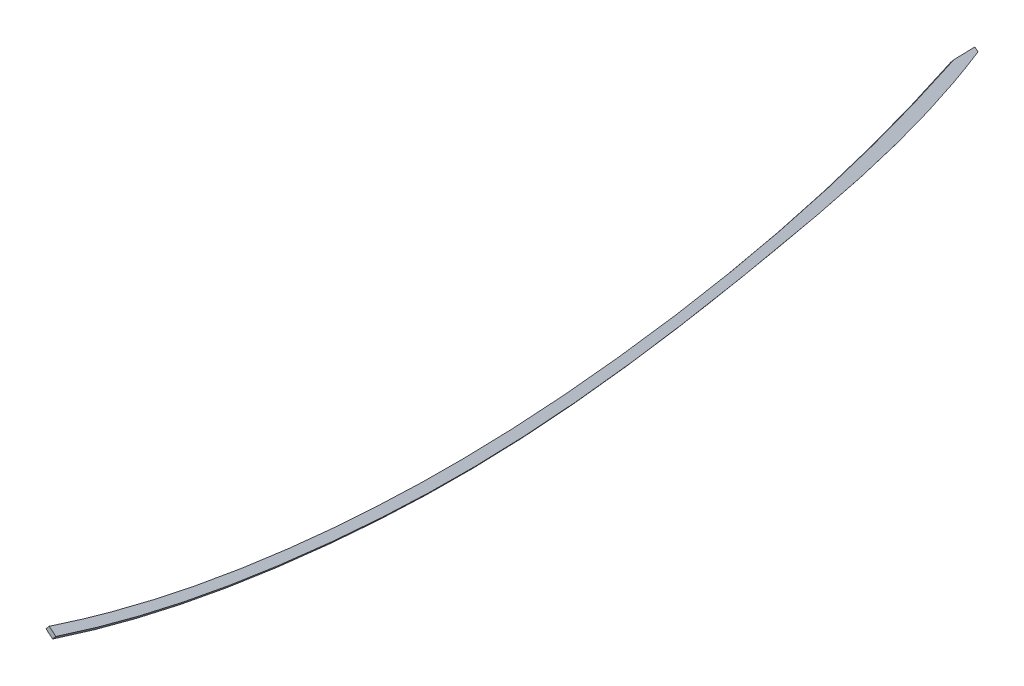
ISO-10303-21;
HEADER;
FILE_DESCRIPTION(('STEP AP214'),'2;1');
FILE_NAME('part.step','',(''),(''),'','','');
FILE_SCHEMA(('AUTOMOTIVE_DESIGN { 1 0 10303 214 1 1 1 1 }'));
ENDSEC;
DATA;
#1=APPLICATION_CONTEXT('core data for automotive mechanical design processes');
#2=APPLICATION_PROTOCOL_DEFINITION('international standard','automotive_design',2000,#1);
#3=PRODUCT_CONTEXT('',#1,'mechanical');
#4=PRODUCT('Part','Part','',(#3));
#5=PRODUCT_RELATED_PRODUCT_CATEGORY('part','',(#4));
#6=PRODUCT_DEFINITION_FORMATION('','',#4);
#7=PRODUCT_DEFINITION_CONTEXT('part definition',#1,'design');
#8=PRODUCT_DEFINITION('design','',#6,#7);
#9=PRODUCT_DEFINITION_SHAPE('','',#8);
#10=(LENGTH_UNIT() NAMED_UNIT(*) SI_UNIT(.MILLI.,.METRE.));
#11=(NAMED_UNIT(*) PLANE_ANGLE_UNIT() SI_UNIT($,.RADIAN.));
#12=(NAMED_UNIT(*) SI_UNIT($,.STERADIAN.) SOLID_ANGLE_UNIT());
#13=UNCERTAINTY_MEASURE_WITH_UNIT(LENGTH_MEASURE(1.E-05),#10,'distance_accuracy_value','');
#14=(GEOMETRIC_REPRESENTATION_CONTEXT(3) GLOBAL_UNCERTAINTY_ASSIGNED_CONTEXT((#13)) GLOBAL_UNIT_ASSIGNED_CONTEXT((#10,
#11,#12)) REPRESENTATION_CONTEXT('',''));
#15=CARTESIAN_POINT('',(0.,0.,0.));
#16=DIRECTION('',(0.,0.,1.));
#17=DIRECTION('',(1.,0.,0.));
#18=AXIS2_PLACEMENT_3D('',#15,#16,#17);
#19=CARTESIAN_POINT('',(2.48042316721792,49.8898428421156,10.2561218582418));
#20=DIRECTION('',(0.,0.,1.));
#21=DIRECTION('',(1.,0.,0.));
#22=AXIS2_PLACEMENT_3D('',#19,#20,#21);
#23=PLANE('',#22);
#24=DIRECTION('',(-0.76604444311898,0.642787609686537,0.));
#25=VECTOR('',#24,1.);
#26=CARTESIAN_POINT('',(0.539204585964579,47.5763886238963,10.2561218582418));
#27=LINE('',#26,#25);
#28=CARTESIAN_POINT('',(2.46006727268094,45.9645934519304,10.2561218582418));
#29=VERTEX_POINT('',#28);
#30=CARTESIAN_POINT('',(0.539204585964579,47.5763886238963,10.2561218582418));
#31=VERTEX_POINT('',#30);
#32=EDGE_CURVE('E122',#29,#31,#27,.T.);
#33=ORIENTED_EDGE('',*,*,#32,.T.);
#34=DIRECTION('',(-0.642787609686538,-0.766044443118979,0.));
#35=VECTOR('',#34,1.);
#36=CARTESIAN_POINT('',(2.48042316721792,49.8898428421156,10.2561218582418));
#37=LINE('',#36,#35);
#38=CARTESIAN_POINT('',(2.48042316721792,49.8898428421156,10.2561218582418));
#39=VERTEX_POINT('',#38);
#40=EDGE_CURVE('E11',#39,#31,#37,.T.);
#41=ORIENTED_EDGE('',*,*,#40,.F.);
#42=DIRECTION('',(-0.76604444311898,0.642787609686537,0.));
#43=VECTOR('',#42,1.);
#44=CARTESIAN_POINT('',(2.48042316721792,49.8898428421156,10.2561218582418));
#45=LINE('',#44,#43);
#46=CARTESIAN_POINT('',(4.40128585393428,48.2780476701497,10.2561218582418));
#47=VERTEX_POINT('',#46);
#48=EDGE_CURVE('E150',#47,#39,#45,.T.);
#49=ORIENTED_EDGE('',*,*,#48,.F.);
#50=DIRECTION('',(-0.642787609686538,-0.766044443118979,0.));
#51=VECTOR('',#50,1.);
#52=CARTESIAN_POINT('',(4.40128585393428,48.2780476701497,10.2561218582418));
#53=LINE('',#52,#51);
#54=EDGE_CURVE('E115',#47,#29,#53,.T.);
#55=ORIENTED_EDGE('',*,*,#54,.T.);
#56=EDGE_LOOP('',(#33,#41,#49,#55));
#57=FACE_BOUND('',#56,.T.);
#58=ADVANCED_FACE('F35',(#57),#23,.F.);
#59=CARTESIAN_POINT('',(2.48042316721792,49.8898428421156,10.2561218582418));
#60=DIRECTION('',(0.76591204130285,-0.642676511371457,-0.0185915765527171));
#61=DIRECTION('',(0.642787609686538,0.766044443118979,0.));
#62=AXIS2_PLACEMENT_3D('',#59,#60,#61);
#63=PLANE('',#62);
#64=DIRECTION('',(0.0142419739070301,-0.0119504350526252,0.999827161704104));
#65=VECTOR('',#64,1.);
#66=CARTESIAN_POINT('',(0.539204585964579,47.5763886238963,10.2561218582418));
#67=LINE('',#66,#65);
#68=CARTESIAN_POINT('',(0.720325396065519,47.4244102189421,22.9713189700257));
#69=VERTEX_POINT('',#68);
#70=EDGE_CURVE('E169',#31,#69,#67,.T.);
#71=ORIENTED_EDGE('',*,*,#70,.T.);
#72=DIRECTION('',(-0.642787609686538,-0.766044443118979,0.));
#73=VECTOR('',#72,1.);
#74=CARTESIAN_POINT('',(2.66154397731886,49.7378644371614,22.9713189700257));
#75=LINE('',#74,#73);
#76=CARTESIAN_POINT('',(2.66154397731886,49.7378644371614,22.9713189700257));
#77=VERTEX_POINT('',#76);
#78=EDGE_CURVE('E43',#77,#69,#75,.T.);
#79=ORIENTED_EDGE('',*,*,#78,.F.);
#80=DIRECTION('',(0.0142419739070301,-0.0119504350526252,0.999827161704104));
#81=VECTOR('',#80,1.);
#82=CARTESIAN_POINT('',(2.48042316721792,49.8898428421156,10.2561218582418));
#83=LINE('',#82,#81);
#84=EDGE_CURVE('E88',#39,#77,#83,.T.);
#85=ORIENTED_EDGE('',*,*,#84,.F.);
#86=ORIENTED_EDGE('',*,*,#40,.T.);
#87=EDGE_LOOP('',(#71,#79,#85,#86));
#88=FACE_BOUND('',#87,.T.);
#89=ADVANCED_FACE('F140',(#88),#63,.F.);
#90=CARTESIAN_POINT('',(2.66154397731886,49.7378644371614,22.9713189700257));
#91=CARTESIAN_POINT('',(3.60586249712661,48.9454871154768,27.5277927775798));
#92=CARTESIAN_POINT('',(6.90223906247647,46.1794987552704,43.876767358655));
#93=CARTESIAN_POINT('',(14.2044692776809,40.0522000749208,83.986139195422));
#94=CARTESIAN_POINT('',(22.757970345705,32.8749604834673,143.807287576109));
#95=CARTESIAN_POINT('',(28.7037433074796,27.8858645841784,204.203556997866));
#96=CARTESIAN_POINT('',(32.1191313510047,25.0200137365292,252.744331416821));
#97=CARTESIAN_POINT('',(34.7043197060017,22.8507831413274,301.363646845112));
#98=CARTESIAN_POINT('',(36.1078456473503,21.673085041594,362.203336360637));
#99=CARTESIAN_POINT('',(34.4525618855359,23.0620330356262,423.012310573511));
#100=CARTESIAN_POINT('',(31.1372004615529,25.8439515837097,471.506682416074));
#101=CARTESIAN_POINT('',(26.2870653699387,29.9136981502432,519.713782663925));
#102=CARTESIAN_POINT('',(20.5538396378893,34.7244457474619,555.328000116366));
#103=CARTESIAN_POINT('',(15.4990409485372,38.9659254633727,578.638126336223));
#104=B_SPLINE_CURVE_WITH_KNOTS('',3,(#90,#91,#92,#93,#94,#95,#96,#97,#98,#99,#100,#101,#102,
#103),.UNSPECIFIED.,.F.,.F.,(4,1,1,1,1,1,1,1,1,1,1,4),(0.,0.0242064129563663,0.0867064129563663,
0.211706412956366,0.336706412956366,0.399206412956366,0.461706412956366,0.586706412956366,
0.711706412956366,0.774206412956366,0.836706412956366,0.961706412956366),.UNSPECIFIED.);
#105=DIRECTION('',(-0.642787609686538,-0.766044443118979,0.));
#106=VECTOR('',#105,1.);
#107=SURFACE_OF_LINEAR_EXTRUSION('',#104,#106);
#108=CARTESIAN_POINT('',(0.720325396065519,47.4244102189421,22.9713189700257));
#109=CARTESIAN_POINT('',(1.66464391587327,46.6320328972575,27.5277927775798));
#110=CARTESIAN_POINT('',(4.96102048122312,43.866044537051,43.876767358655));
#111=CARTESIAN_POINT('',(12.2632506964275,37.7387458567015,83.986139195422));
#112=CARTESIAN_POINT('',(20.8167517644516,30.561506265248,143.807287576109));
#113=CARTESIAN_POINT('',(26.7625247262262,25.5724103659591,204.203556997866));
#114=CARTESIAN_POINT('',(30.1779127697514,22.7065595183099,252.744331416821));
#115=CARTESIAN_POINT('',(32.7631011247484,20.5373289231081,301.363646845112));
#116=CARTESIAN_POINT('',(34.166627066097,19.3596308233747,362.203336360637));
#117=CARTESIAN_POINT('',(32.5113433042826,20.7485788174069,423.012310573511));
#118=CARTESIAN_POINT('',(29.1959818802996,23.5304973654904,471.506682416074));
#119=CARTESIAN_POINT('',(24.3458467886853,27.6002439320239,519.713782663925));
#120=CARTESIAN_POINT('',(18.612621056636,32.4109915292426,555.328000116366));
#121=CARTESIAN_POINT('',(13.5578223672838,36.6524712451534,578.638126336223));
#122=B_SPLINE_CURVE_WITH_KNOTS('',3,(#108,#109,#110,#111,#112,#113,#114,#115,#116,#117,#118,
#119,#120,#121),.UNSPECIFIED.,.F.,.F.,(4,1,1,1,1,1,1,1,1,1,1,4),(0.,0.0242064129563663,
0.0867064129563663,0.211706412956366,0.336706412956366,0.399206412956366,0.461706412956366,
0.586706412956366,0.711706412956366,0.774206412956366,0.836706412956366,0.961706412956366),.UNSPECIFIED.);
#123=CARTESIAN_POINT('',(13.5578223672838,36.6524712451534,578.638126336223));
#124=VERTEX_POINT('',#123);
#125=EDGE_CURVE('E166',#69,#124,#122,.T.);
#126=ORIENTED_EDGE('',*,*,#125,.T.);
#127=DIRECTION('',(-0.642787609686538,-0.766044443118979,0.));
#128=VECTOR('',#127,1.);
#129=CARTESIAN_POINT('',(15.4990409485372,38.9659254633727,578.638126336223));
#130=LINE('',#129,#128);
#131=CARTESIAN_POINT('',(15.4990409485372,38.9659254633727,578.638126336223));
#132=VERTEX_POINT('',#131);
#133=EDGE_CURVE('E110',#132,#124,#130,.T.);
#134=ORIENTED_EDGE('',*,*,#133,.F.);
#135=EDGE_CURVE('E101',#77,#132,#104,.T.);
#136=ORIENTED_EDGE('',*,*,#135,.F.);
#137=ORIENTED_EDGE('',*,*,#78,.T.);
#138=EDGE_LOOP('',(#126,#134,#136,#137));
#139=FACE_BOUND('',#138,.T.);
#140=ADVANCED_FACE('F138',(#139),#107,.F.);
#141=CARTESIAN_POINT('',(15.4990409485371,38.9659254633727,578.638126336223));
#142=DIRECTION('',(0.73708127933529,-0.618484629637917,0.272374651087617));
#143=DIRECTION('',(0.642787609686538,0.766044443118979,0.));
#144=AXIS2_PLACEMENT_3D('',#141,#142,#143);
#145=PLANE('',#144);
#146=DIRECTION('',(-0.20865108791214,0.175079050911814,0.962191274874647));
#147=VECTOR('',#146,1.);
#148=CARTESIAN_POINT('',(13.5578223672838,36.6524712451534,578.638126336223));
#149=LINE('',#148,#147);
#150=CARTESIAN_POINT('',(13.2625002792163,36.9002759003293,579.999999592));
#151=VERTEX_POINT('',#150);
#152=EDGE_CURVE('E109',#124,#151,#149,.T.);
#153=ORIENTED_EDGE('',*,*,#152,.T.);
#154=DIRECTION('',(-0.642787609686538,-0.766044443118979,0.));
#155=VECTOR('',#154,1.);
#156=CARTESIAN_POINT('',(15.2037188604697,39.2137301185486,579.999999592));
#157=LINE('',#156,#155);
#158=CARTESIAN_POINT('',(15.2037188604697,39.2137301185486,579.999999592));
#159=VERTEX_POINT('',#158);
#160=EDGE_CURVE('E106',#159,#151,#157,.T.);
#161=ORIENTED_EDGE('',*,*,#160,.F.);
#162=DIRECTION('',(-0.20865108791214,0.175079050911814,0.962191274874647));
#163=VECTOR('',#162,1.);
#164=CARTESIAN_POINT('',(15.4990409485371,38.9659254633727,578.638126336223));
#165=LINE('',#164,#163);
#166=EDGE_CURVE('E95',#132,#159,#165,.T.);
#167=ORIENTED_EDGE('',*,*,#166,.F.);
#168=ORIENTED_EDGE('',*,*,#133,.T.);
#169=EDGE_LOOP('',(#153,#161,#167,#168));
#170=FACE_BOUND('',#169,.T.);
#171=ADVANCED_FACE('F107',(#170),#145,.F.);
#172=CARTESIAN_POINT('',(15.2037188604697,39.2137301185486,579.999999592));
#173=DIRECTION('',(0.,0.,-1.));
#174=DIRECTION('',(-1.,0.,0.));
#175=AXIS2_PLACEMENT_3D('',#172,#173,#174);
#176=PLANE('',#175);
#177=DIRECTION('',(0.766044443118979,-0.642787609686538,0.));
#178=VECTOR('',#177,1.);
#179=CARTESIAN_POINT('',(13.2625002792163,36.9002759003293,579.999999592));
#180=LINE('',#179,#178);
#181=CARTESIAN_POINT('',(17.2432287640341,33.5600480969018,579.999999592));
#182=VERTEX_POINT('',#181);
#183=EDGE_CURVE('E74',#151,#182,#180,.T.);
#184=ORIENTED_EDGE('',*,*,#183,.T.);
#185=DIRECTION('',(-0.642787609686538,-0.766044443118979,0.));
#186=VECTOR('',#185,1.);
#187=CARTESIAN_POINT('',(19.1844473452874,35.8735023151212,579.999999592));
#188=LINE('',#187,#186);
#189=CARTESIAN_POINT('',(19.1844473452874,35.8735023151212,579.999999592));
#190=VERTEX_POINT('',#189);
#191=EDGE_CURVE('E111',#190,#182,#188,.T.);
#192=ORIENTED_EDGE('',*,*,#191,.F.);
#193=DIRECTION('',(0.766044443118979,-0.642787609686538,0.));
#194=VECTOR('',#193,1.);
#195=CARTESIAN_POINT('',(15.2037188604697,39.2137301185486,579.999999592));
#196=LINE('',#195,#194);
#197=EDGE_CURVE('E99',#159,#190,#196,.T.);
#198=ORIENTED_EDGE('',*,*,#197,.F.);
#199=ORIENTED_EDGE('',*,*,#160,.T.);
#200=EDGE_LOOP('',(#184,#192,#198,#199));
#201=FACE_BOUND('',#200,.T.);
#202=ADVANCED_FACE('F113',(#201),#176,.F.);
#203=CARTESIAN_POINT('',(19.1844473452874,35.8735023151212,579.999999592));
#204=CARTESIAN_POINT('',(28.403247495778,28.1380105089475,537.624946517335));
#205=CARTESIAN_POINT('',(37.2104355529574,20.7479022584593,460.757346258166));
#206=CARTESIAN_POINT('',(40.8755671645649,17.6724916749433,349.992619040852));
#207=CARTESIAN_POINT('',(36.4858146449487,21.3559313951128,249.65526662979));
#208=CARTESIAN_POINT('',(27.1843968741186,29.1607476160421,149.790758513288));
#209=CARTESIAN_POINT('',(17.8369021877719,37.0042269597872,68.8345138525367));
#210=CARTESIAN_POINT('',(7.82933098958451,45.4015762611666,23.417958502108));
#211=CARTESIAN_POINT('',(4.40128585393428,48.2780476701497,10.2561218582418));
#212=B_SPLINE_CURVE_WITH_KNOTS('',3,(#203,#204,#205,#206,#207,#208,#209,#210,#211),
.UNSPECIFIED.,.F.,.F.,(4,1,1,1,1,1,4),(0.,0.225071004183071,0.39564019727107,0.566277038425493,
0.737858902627529,0.910958545331661,0.981893872620999),.UNSPECIFIED.);
#213=DIRECTION('',(-0.642787609686538,-0.766044443118979,0.));
#214=VECTOR('',#213,1.);
#215=SURFACE_OF_LINEAR_EXTRUSION('',#212,#214);
#216=CARTESIAN_POINT('',(17.2432287640341,33.5600480969018,579.999999592));
#217=CARTESIAN_POINT('',(26.4620289145246,25.8245562907282,537.624946517335));
#218=CARTESIAN_POINT('',(35.2692169717041,18.43444804024,460.757346258166));
#219=CARTESIAN_POINT('',(38.9343485833115,15.359037456724,349.992619040852));
#220=CARTESIAN_POINT('',(34.5445960636953,19.0424771768935,249.65526662979));
#221=CARTESIAN_POINT('',(25.2431782928653,26.8472933978228,149.790758513288));
#222=CARTESIAN_POINT('',(15.8956836065185,34.6907727415679,68.8345138525367));
#223=CARTESIAN_POINT('',(5.88811240833116,43.0881220429472,23.417958502108));
#224=CARTESIAN_POINT('',(2.46006727268094,45.9645934519304,10.2561218582418));
#225=B_SPLINE_CURVE_WITH_KNOTS('',3,(#216,#217,#218,#219,#220,#221,#222,#223,#224),
.UNSPECIFIED.,.F.,.F.,(4,1,1,1,1,1,4),(0.,0.225071004183071,0.39564019727107,0.566277038425493,
0.737858902627529,0.910958545331661,0.981893872620999),.UNSPECIFIED.);
#226=EDGE_CURVE('E80',#182,#29,#225,.T.);
#227=ORIENTED_EDGE('',*,*,#226,.T.);
#228=ORIENTED_EDGE('',*,*,#54,.F.);
#229=EDGE_CURVE('E51',#190,#47,#212,.T.);
#230=ORIENTED_EDGE('',*,*,#229,.F.);
#231=ORIENTED_EDGE('',*,*,#191,.T.);
#232=EDGE_LOOP('',(#227,#228,#230,#231));
#233=FACE_BOUND('',#232,.T.);
#234=ADVANCED_FACE('F128',(#233),#215,.F.);
#235=CARTESIAN_POINT('',(38.1774580967354,19.9364739986351,294.087109932894));
#236=DIRECTION('',(-0.642787609686538,-0.766044443118979,0.));
#237=DIRECTION('',(0.766044443118979,-0.642787609686538,0.));
#238=AXIS2_PLACEMENT_3D('',#235,#236,#237);
#239=PLANE('',#238);
#240=ORIENTED_EDGE('',*,*,#48,.T.);
#241=ORIENTED_EDGE('',*,*,#84,.T.);
#242=ORIENTED_EDGE('',*,*,#135,.T.);
#243=ORIENTED_EDGE('',*,*,#166,.T.);
#244=ORIENTED_EDGE('',*,*,#197,.T.);
#245=ORIENTED_EDGE('',*,*,#229,.T.);
#246=EDGE_LOOP('',(#240,#241,#242,#243,#244,#245));
#247=FACE_BOUND('',#246,.T.);
#248=ADVANCED_FACE('F97',(#247),#239,.F.);
#249=CARTESIAN_POINT('',(36.2362395154821,17.6230197804158,294.087109932894));
#250=DIRECTION('',(-0.642787609686538,-0.766044443118979,0.));
#251=DIRECTION('',(0.766044443118979,-0.642787609686538,0.));
#252=AXIS2_PLACEMENT_3D('',#249,#250,#251);
#253=PLANE('',#252);
#254=ORIENTED_EDGE('',*,*,#32,.F.);
#255=ORIENTED_EDGE('',*,*,#226,.F.);
#256=ORIENTED_EDGE('',*,*,#183,.F.);
#257=ORIENTED_EDGE('',*,*,#152,.F.);
#258=ORIENTED_EDGE('',*,*,#125,.F.);
#259=ORIENTED_EDGE('',*,*,#70,.F.);
#260=EDGE_LOOP('',(#254,#255,#256,#257,#258,#259));
#261=FACE_BOUND('',#260,.T.);
#262=ADVANCED_FACE('F132',(#261),#253,.T.);
#263=CLOSED_SHELL('',(#58,#89,#140,#171,#202,#234,#248,#262));
#264=MANIFOLD_SOLID_BREP('B2',#263);
#265=ADVANCED_BREP_SHAPE_REPRESENTATION('',(#18,#264),#14);
#266=SHAPE_DEFINITION_REPRESENTATION(#9,#265);
ENDSEC;
END-ISO-10303-21;
